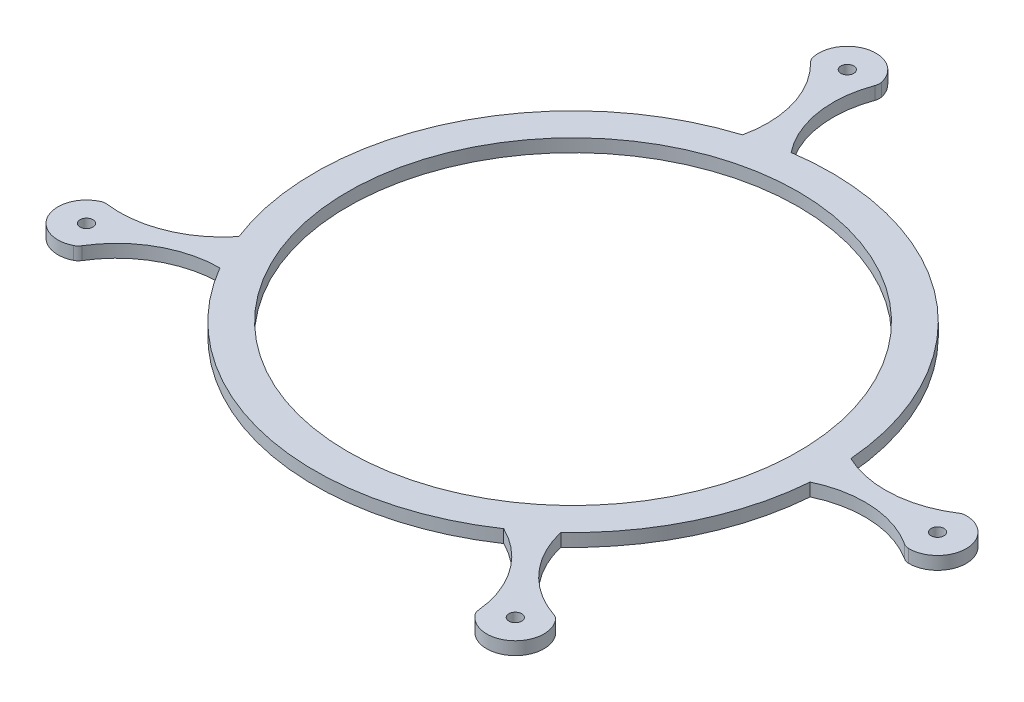
ISO-10303-21;
HEADER;
FILE_DESCRIPTION(('STEP AP214'),'2;1');
FILE_NAME('part.step','',(''),(''),'','','');
FILE_SCHEMA(('AUTOMOTIVE_DESIGN { 1 0 10303 214 1 1 1 1 }'));
ENDSEC;
DATA;
#1=APPLICATION_CONTEXT('core data for automotive mechanical design processes');
#2=APPLICATION_PROTOCOL_DEFINITION('international standard','automotive_design',2000,#1);
#3=PRODUCT_CONTEXT('',#1,'mechanical');
#4=PRODUCT('Part','Part','',(#3));
#5=PRODUCT_RELATED_PRODUCT_CATEGORY('part','',(#4));
#6=PRODUCT_DEFINITION_FORMATION('','',#4);
#7=PRODUCT_DEFINITION_CONTEXT('part definition',#1,'design');
#8=PRODUCT_DEFINITION('design','',#6,#7);
#9=PRODUCT_DEFINITION_SHAPE('','',#8);
#10=(LENGTH_UNIT() NAMED_UNIT(*) SI_UNIT(.MILLI.,.METRE.));
#11=(NAMED_UNIT(*) PLANE_ANGLE_UNIT() SI_UNIT($,.RADIAN.));
#12=(NAMED_UNIT(*) SI_UNIT($,.STERADIAN.) SOLID_ANGLE_UNIT());
#13=UNCERTAINTY_MEASURE_WITH_UNIT(LENGTH_MEASURE(1.E-05),#10,'distance_accuracy_value','');
#14=(GEOMETRIC_REPRESENTATION_CONTEXT(3) GLOBAL_UNCERTAINTY_ASSIGNED_CONTEXT((#13)) GLOBAL_UNIT_ASSIGNED_CONTEXT((#10,
#11,#12)) REPRESENTATION_CONTEXT('',''));
#15=CARTESIAN_POINT('',(0.,0.,0.));
#16=DIRECTION('',(0.,0.,1.));
#17=DIRECTION('',(1.,0.,0.));
#18=AXIS2_PLACEMENT_3D('',#15,#16,#17);
#19=CARTESIAN_POINT('',(20.2378364940883,3.175,203.705607036524));
#20=DIRECTION('',(0.,1.,0.));
#21=DIRECTION('',(0.,0.,1.));
#22=AXIS2_PLACEMENT_3D('',#19,#20,#21);
#23=PLANE('',#22);
#24=CARTESIAN_POINT('',(38.977113713879,3.175,259.76572866438));
#25=DIRECTION('',(0.,1.,0.));
#26=DIRECTION('',(0.,0.,1.));
#27=AXIS2_PLACEMENT_3D('',#24,#25,#26);
#28=CIRCLE('',#27,1.5875);
#29=CARTESIAN_POINT('',(38.977113713879,3.175,261.35322866438));
#30=VERTEX_POINT('',#29);
#31=EDGE_CURVE('E748',#30,#30,#28,.T.);
#32=ORIENTED_EDGE('',*,*,#31,.F.);
#33=EDGE_LOOP('',(#32));
#34=FACE_BOUND('',#33,.T.);
#35=CARTESIAN_POINT('',(-36.8463826333885,3.175,102.316616136352));
#36=DIRECTION('',(0.,1.,0.));
#37=DIRECTION('',(0.,0.,1.));
#38=AXIS2_PLACEMENT_3D('',#35,#36,#37);
#39=CIRCLE('',#38,1.5875);
#40=CARTESIAN_POINT('',(-36.8463826333885,3.175,103.904116136352));
#41=VERTEX_POINT('',#40);
#42=EDGE_CURVE('E760',#41,#41,#39,.T.);
#43=ORIENTED_EDGE('',*,*,#42,.F.);
#44=EDGE_LOOP('',(#43));
#45=FACE_BOUND('',#44,.T.);
#46=CARTESIAN_POINT('',(57.378673689453,3.175,217.716932549327));
#47=DIRECTION('',(0.,-1.,0.));
#48=DIRECTION('',(0.,0.,1.));
#49=AXIS2_PLACEMENT_3D('',#46,#47,#48);
#50=CIRCLE('',#49,25.5117833148735);
#51=CARTESIAN_POINT('',(46.4003306876611,3.175,194.688101210328));
#52=VERTEX_POINT('',#51);
#53=CARTESIAN_POINT('',(71.2743942306114,3.175,196.321605055991));
#54=VERTEX_POINT('',#53);
#55=EDGE_CURVE('E143',#52,#54,#50,.T.);
#56=ORIENTED_EDGE('',*,*,#55,.T.);
#57=CARTESIAN_POINT('',(72.6641172245387,3.175,194.195512395699));
#58=DIRECTION('',(0.,1.,0.));
#59=DIRECTION('',(0.,0.,1.));
#60=AXIS2_PLACEMENT_3D('',#57,#58,#59);
#61=CIRCLE('',#60,2.54000000000001);
#62=CARTESIAN_POINT('',(72.6316015802498,3.175,196.735304263722));
#63=VERTEX_POINT('',#62);
#64=EDGE_CURVE('E411',#54,#63,#61,.T.);
#65=ORIENTED_EDGE('',*,*,#64,.T.);
#66=CARTESIAN_POINT('',(72.7217441599338,3.175,189.694281523722));
#67=DIRECTION('',(0.,1.,0.));
#68=DIRECTION('',(0.,0.,1.));
#69=AXIS2_PLACEMENT_3D('',#66,#67,#68);
#70=CIRCLE('',#69,7.04159974081697);
#71=CARTESIAN_POINT('',(72.6316015802499,3.175,182.653258783721));
#72=VERTEX_POINT('',#71);
#73=EDGE_CURVE('E348',#63,#72,#70,.T.);
#74=ORIENTED_EDGE('',*,*,#73,.T.);
#75=CARTESIAN_POINT('',(72.6641172245386,3.175,185.193050651744));
#76=DIRECTION('',(0.,1.,0.));
#77=DIRECTION('',(0.,0.,1.));
#78=AXIS2_PLACEMENT_3D('',#75,#76,#77);
#79=CIRCLE('',#78,2.53999999999997);
#80=CARTESIAN_POINT('',(71.2743942306112,3.175,183.066957991452));
#81=VERTEX_POINT('',#80);
#82=EDGE_CURVE('E365',#72,#81,#79,.T.);
#83=ORIENTED_EDGE('',*,*,#82,.T.);
#84=CARTESIAN_POINT('',(57.3786736894533,3.175,161.671630498115));
#85=DIRECTION('',(0.,-1.,0.));
#86=DIRECTION('',(0.,0.,-1.));
#87=AXIS2_PLACEMENT_3D('',#84,#85,#86);
#88=CIRCLE('',#87,25.511783314874);
#89=CARTESIAN_POINT('',(46.4003306876612,3.175,184.700461837115));
#90=VERTEX_POINT('',#89);
#91=EDGE_CURVE('E362',#81,#90,#88,.T.);
#92=ORIENTED_EDGE('',*,*,#91,.T.);
#93=CARTESIAN_POINT('',(-16.9030007012765,3.175,189.694281523721));
#94=DIRECTION('',(0.,1.,0.));
#95=DIRECTION('',(0.,0.,1.));
#96=AXIS2_PLACEMENT_3D('',#93,#94,#95);
#97=CIRCLE('',#96,63.5);
#98=CARTESIAN_POINT('',(-26.1207029236127,3.175,126.866867397877));
#99=VERTEX_POINT('',#98);
#100=EDGE_CURVE('E364',#90,#99,#97,.T.);
#101=ORIENTED_EDGE('',*,*,#100,.T.);
#102=CARTESIAN_POINT('',(-6.11216360434647,3.175,111.039377318447));
#103=DIRECTION('',(0.,-1.,0.));
#104=DIRECTION('',(0.,0.,1.));
#105=AXIS2_PLACEMENT_3D('',#102,#103,#104);
#106=CIRCLE('',#105,25.5117833148736);
#107=CARTESIAN_POINT('',(-30.0631542806852,3.175,102.252959759112));
#108=VERTEX_POINT('',#107);
#109=EDGE_CURVE('E367',#99,#108,#106,.T.);
#110=ORIENTED_EDGE('',*,*,#109,.T.);
#111=CARTESIAN_POINT('',(-32.4451838176385,3.175,101.371180146577));
#112=DIRECTION('',(0.,1.,0.));
#113=DIRECTION('',(0.,0.,1.));
#114=AXIS2_PLACEMENT_3D('',#111,#112,#113);
#115=CIRCLE('',#114,2.53999999999999);
#116=CARTESIAN_POINT('',(-29.961834422835,3.175,100.83772369725));
#117=VERTEX_POINT('',#116);
#118=EDGE_CURVE('E373',#108,#117,#115,.T.);
#119=ORIENTED_EDGE('',*,*,#118,.T.);
#120=CARTESIAN_POINT('',(-36.8463826333885,3.175,102.316616136352));
#121=DIRECTION('',(0.,1.,0.));
#122=DIRECTION('',(0.,0.,1.));
#123=AXIS2_PLACEMENT_3D('',#120,#121,#122);
#124=CIRCLE('',#123,7.04159974081698);
#125=CARTESIAN_POINT('',(-43.6908136219012,3.175,103.971273609475));
#126=VERTEX_POINT('',#125);
#127=EDGE_CURVE('E375',#117,#126,#124,.T.);
#128=ORIENTED_EDGE('',*,*,#127,.T.);
#129=CARTESIAN_POINT('',(-41.2219350501687,3.175,103.374416341748));
#130=DIRECTION('',(0.,1.,0.));
#131=DIRECTION('',(0.,0.,1.));
#132=AXIS2_PLACEMENT_3D('',#129,#130,#131);
#133=CIRCLE('',#132,2.54000000000001);
#134=CARTESIAN_POINT('',(-42.9854796700234,3.175,105.202396203175));
#135=VERTEX_POINT('',#134);
#136=EDGE_CURVE('E377',#126,#135,#133,.T.);
#137=ORIENTED_EDGE('',*,*,#136,.T.);
#138=CARTESIAN_POINT('',(-60.7522929207341,3.175,123.510630274746));
#139=DIRECTION('',(0.,-1.,0.));
#140=DIRECTION('',(0.,0.,-1.));
#141=AXIS2_PLACEMENT_3D('',#138,#139,#140);
#142=CIRCLE('',#141,25.511783314874);
#143=CARTESIAN_POINT('',(-35.8579313253644,3.175,129.089326239223));
#144=VERTEX_POINT('',#143);
#145=EDGE_CURVE('E379',#135,#144,#142,.T.);
#146=ORIENTED_EDGE('',*,*,#145,.T.);
#147=CARTESIAN_POINT('',(-16.9030007012765,3.175,189.694281523721));
#148=DIRECTION('',(0.,1.,0.));
#149=DIRECTION('',(0.,0.,1.));
#150=AXIS2_PLACEMENT_3D('',#147,#148,#149);
#151=CIRCLE('',#150,63.5);
#152=CARTESIAN_POINT('',(-76.1040686753232,3.175,212.6612915758));
#153=VERTEX_POINT('',#152);
#154=EDGE_CURVE('E381',#144,#153,#151,.T.);
#155=ORIENTED_EDGE('',*,*,#154,.T.);
#156=CARTESIAN_POINT('',(-95.9870493899646,3.175,196.676355986119));
#157=DIRECTION('',(0.,-1.,0.));
#158=DIRECTION('',(0.,0.,1.));
#159=AXIS2_PLACEMENT_3D('',#156,#157,#158);
#160=CIRCLE('',#159,25.5117833148736);
#161=CARTESIAN_POINT('',(-99.2235763021672,3.175,221.982007162322));
#162=VERTEX_POINT('',#161);
#163=EDGE_CURVE('E383',#153,#162,#160,.T.);
#164=ORIENTED_EDGE('',*,*,#163,.T.);
#165=CARTESIAN_POINT('',(-99.5531964215459,3.175,224.500528668464));
#166=DIRECTION('',(0.,1.,0.));
#167=DIRECTION('',(0.,0.,1.));
#168=AXIS2_PLACEMENT_3D('',#165,#166,#167);
#169=CIRCLE('',#168,2.54);
#170=CARTESIAN_POINT('',(-100.6258752306,3.175,222.198147255099));
#171=VERTEX_POINT('',#170);
#172=EDGE_CURVE('E385',#162,#171,#169,.T.);
#173=ORIENTED_EDGE('',*,*,#172,.T.);
#174=CARTESIAN_POINT('',(-97.6521056149244,3.175,228.581000941559));
#175=DIRECTION('',(0.,1.,0.));
#176=DIRECTION('',(0.,0.,1.));
#177=AXIS2_PLACEMENT_3D('',#174,#175,#176);
#178=CIRCLE('',#177,7.041599740817);
#179=CARTESIAN_POINT('',(-94.5159046833139,3.175,234.885631828966));
#180=VERTEX_POINT('',#179);
#181=EDGE_CURVE('E387',#171,#180,#178,.T.);
#182=ORIENTED_EDGE('',*,*,#181,.T.);
#183=CARTESIAN_POINT('',(-95.6471746588161,3.175,232.611466434249));
#184=DIRECTION('',(0.,1.,0.));
#185=DIRECTION('',(0.,0.,1.));
#186=AXIS2_PLACEMENT_3D('',#183,#184,#185);
#187=CIRCLE('',#186,2.54000000000003);
#188=CARTESIAN_POINT('',(-93.4726004731212,3.175,233.924031522506));
#189=VERTEX_POINT('',#188);
#190=EDGE_CURVE('E389',#180,#189,#187,.T.);
#191=ORIENTED_EDGE('',*,*,#190,.T.);
#192=CARTESIAN_POINT('',(-71.6699041760122,3.175,247.171428326448));
#193=DIRECTION('',(0.,-1.,0.));
#194=DIRECTION('',(0.,0.,-1.));
#195=AXIS2_PLACEMENT_3D('',#192,#193,#194);
#196=CIRCLE('',#195,25.511783314874);
#197=CARTESIAN_POINT('',(-71.7705943591158,3.175,221.659843714902));
#198=VERTEX_POINT('',#197);
#199=EDGE_CURVE('E391',#189,#198,#196,.T.);
#200=ORIENTED_EDGE('',*,*,#199,.T.);
#201=CARTESIAN_POINT('',(-16.9030007012765,3.175,189.694281523721));
#202=DIRECTION('',(0.,1.,0.));
#203=DIRECTION('',(0.,0.,1.));
#204=AXIS2_PLACEMENT_3D('',#201,#202,#203);
#205=CIRCLE('',#204,63.5);
#206=CARTESIAN_POINT('',(18.661655394652,3.175,242.30041459562));
#207=VERTEX_POINT('',#206);
#208=EDGE_CURVE('E393',#198,#207,#205,.T.);
#209=ORIENTED_EDGE('',*,*,#208,.T.);
#210=CARTESIAN_POINT('',(7.50187495230056,3.175,265.241870268344));
#211=DIRECTION('',(0.,-1.,0.));
#212=DIRECTION('',(0.,0.,1.));
#213=AXIS2_PLACEMENT_3D('',#210,#211,#212);
#214=CIRCLE('',#213,25.5117833148735);
#215=CARTESIAN_POINT('',(32.8932556111954,3.175,262.766213559477));
#216=VERTEX_POINT('',#215);
#217=EDGE_CURVE('E395',#207,#216,#214,.T.);
#218=ORIENTED_EDGE('',*,*,#217,.T.);
#219=CARTESIAN_POINT('',(35.4219799017786,3.175,262.52714565654));
#220=DIRECTION('',(0.,1.,0.));
#221=DIRECTION('',(0.,0.,1.));
#222=AXIS2_PLACEMENT_3D('',#219,#220,#221);
#223=CIRCLE('',#222,2.54000000000002);
#224=CARTESIAN_POINT('',(33.4160174878268,3.175,264.085258230718));
#225=VERTEX_POINT('',#224);
#226=EDGE_CURVE('E397',#216,#225,#223,.T.);
#227=ORIENTED_EDGE('',*,*,#226,.T.);
#228=CARTESIAN_POINT('',(38.977113713879,3.175,259.76572866438));
#229=DIRECTION('',(0.,1.,0.));
#230=DIRECTION('',(0.,0.,1.));
#231=AXIS2_PLACEMENT_3D('',#228,#229,#230);
#232=CIRCLE('',#231,7.04159974081696);
#233=CARTESIAN_POINT('',(44.4258039816384,3.175,255.305246484627));
#234=VERTEX_POINT('',#233);
#235=EDGE_CURVE('E211',#225,#234,#232,.T.);
#236=ORIENTED_EDGE('',*,*,#235,.T.);
#237=CARTESIAN_POINT('',(42.4603879129161,3.175,256.914202567561));
#238=DIRECTION('',(0.,1.,0.));
#239=DIRECTION('',(0.,0.,1.));
#240=AXIS2_PLACEMENT_3D('',#237,#238,#239);
#241=CIRCLE('',#240,2.53999999999996);
#242=CARTESIAN_POINT('',(43.2561559752546,3.175,254.5020762875));
#243=VERTEX_POINT('',#242);
#244=EDGE_CURVE('E205',#234,#243,#241,.T.);
#245=ORIENTED_EDGE('',*,*,#244,.T.);
#246=CARTESIAN_POINT('',(51.3198565403681,3.175,230.298195997321));
#247=DIRECTION('',(0.,-1.,0.));
#248=DIRECTION('',(0.,0.,-1.));
#249=AXIS2_PLACEMENT_3D('',#246,#247,#248);
#250=CIRCLE('',#249,25.511783314874);
#251=CARTESIAN_POINT('',(26.4703062921673,3.175,236.073223301779));
#252=VERTEX_POINT('',#251);
#253=EDGE_CURVE('E209',#243,#252,#250,.T.);
#254=ORIENTED_EDGE('',*,*,#253,.T.);
#255=CARTESIAN_POINT('',(-16.9030007012765,3.175,189.694281523721));
#256=DIRECTION('',(0.,1.,0.));
#257=DIRECTION('',(0.,0.,1.));
#258=AXIS2_PLACEMENT_3D('',#255,#256,#257);
#259=CIRCLE('',#258,63.5);
#260=EDGE_CURVE('E54',#252,#52,#259,.T.);
#261=ORIENTED_EDGE('',*,*,#260,.T.);
#262=EDGE_LOOP('',(#56,#65,#74,#83,#92,#101,#110,#119,#128,#137,#146,#155,#164,#173,#182,#191,
#200,#209,#218,#227,#236,#245,#254,#261));
#263=FACE_BOUND('',#262,.T.);
#264=CARTESIAN_POINT('',(-97.6521056149244,3.175,228.581000941559));
#265=DIRECTION('',(0.,1.,0.));
#266=DIRECTION('',(0.,0.,1.));
#267=AXIS2_PLACEMENT_3D('',#264,#265,#266);
#268=CIRCLE('',#267,1.5875);
#269=CARTESIAN_POINT('',(-97.6521056149244,3.175,230.168500941559));
#270=VERTEX_POINT('',#269);
#271=EDGE_CURVE('E232',#270,#270,#268,.T.);
#272=ORIENTED_EDGE('',*,*,#271,.F.);
#273=EDGE_LOOP('',(#272));
#274=FACE_BOUND('',#273,.T.);
#275=CARTESIAN_POINT('',(72.7217441599338,3.175,189.694281523722));
#276=DIRECTION('',(0.,1.,0.));
#277=DIRECTION('',(0.,0.,1.));
#278=AXIS2_PLACEMENT_3D('',#275,#276,#277);
#279=CIRCLE('',#278,1.5875);
#280=CARTESIAN_POINT('',(72.7217441599338,3.175,191.281781523722));
#281=VERTEX_POINT('',#280);
#282=EDGE_CURVE('E754',#281,#281,#279,.T.);
#283=ORIENTED_EDGE('',*,*,#282,.F.);
#284=EDGE_LOOP('',(#283));
#285=FACE_BOUND('',#284,.T.);
#286=CARTESIAN_POINT('',(-16.9030007012765,3.175,189.694281523721));
#287=DIRECTION('',(0.,1.,0.));
#288=DIRECTION('',(0.,0.,1.));
#289=AXIS2_PLACEMENT_3D('',#286,#287,#288);
#290=CIRCLE('',#289,55.372);
#291=CARTESIAN_POINT('',(-16.9030007012765,3.175,245.066281523721));
#292=VERTEX_POINT('',#291);
#293=EDGE_CURVE('E739',#292,#292,#290,.T.);
#294=ORIENTED_EDGE('',*,*,#293,.F.);
#295=EDGE_LOOP('',(#294));
#296=FACE_BOUND('',#295,.T.);
#297=ADVANCED_FACE('F37',(#34,#45,#263,#274,#285,#296),#23,.T.);
#298=CARTESIAN_POINT('',(20.2378364940883,0.,203.705607036524));
#299=DIRECTION('',(0.,1.,0.));
#300=DIRECTION('',(0.,0.,1.));
#301=AXIS2_PLACEMENT_3D('',#298,#299,#300);
#302=PLANE('',#301);
#303=CARTESIAN_POINT('',(38.977113713879,0.,259.76572866438));
#304=DIRECTION('',(0.,1.,0.));
#305=DIRECTION('',(0.,0.,1.));
#306=AXIS2_PLACEMENT_3D('',#303,#304,#305);
#307=CIRCLE('',#306,1.5875);
#308=CARTESIAN_POINT('',(38.977113713879,0.,261.35322866438));
#309=VERTEX_POINT('',#308);
#310=EDGE_CURVE('E745',#309,#309,#307,.T.);
#311=ORIENTED_EDGE('',*,*,#310,.T.);
#312=EDGE_LOOP('',(#311));
#313=FACE_BOUND('',#312,.T.);
#314=CARTESIAN_POINT('',(-36.8463826333885,0.,102.316616136352));
#315=DIRECTION('',(0.,1.,0.));
#316=DIRECTION('',(0.,0.,1.));
#317=AXIS2_PLACEMENT_3D('',#314,#315,#316);
#318=CIRCLE('',#317,1.5875);
#319=CARTESIAN_POINT('',(-36.8463826333885,0.,103.904116136352));
#320=VERTEX_POINT('',#319);
#321=EDGE_CURVE('E757',#320,#320,#318,.T.);
#322=ORIENTED_EDGE('',*,*,#321,.T.);
#323=EDGE_LOOP('',(#322));
#324=FACE_BOUND('',#323,.T.);
#325=CARTESIAN_POINT('',(57.378673689453,0.,217.716932549327));
#326=DIRECTION('',(0.,-1.,0.));
#327=DIRECTION('',(0.,0.,1.));
#328=AXIS2_PLACEMENT_3D('',#325,#326,#327);
#329=CIRCLE('',#328,25.5117833148735);
#330=CARTESIAN_POINT('',(46.4003306876611,0.,194.688101210328));
#331=VERTEX_POINT('',#330);
#332=CARTESIAN_POINT('',(71.2743942306114,0.,196.321605055991));
#333=VERTEX_POINT('',#332);
#334=EDGE_CURVE('E137',#331,#333,#329,.T.);
#335=ORIENTED_EDGE('',*,*,#334,.F.);
#336=CARTESIAN_POINT('',(-16.9030007012765,0.,189.694281523721));
#337=DIRECTION('',(0.,1.,0.));
#338=DIRECTION('',(0.,0.,1.));
#339=AXIS2_PLACEMENT_3D('',#336,#337,#338);
#340=CIRCLE('',#339,63.5);
#341=CARTESIAN_POINT('',(26.4703062921673,0.,236.073223301779));
#342=VERTEX_POINT('',#341);
#343=EDGE_CURVE('E282',#342,#331,#340,.T.);
#344=ORIENTED_EDGE('',*,*,#343,.F.);
#345=CARTESIAN_POINT('',(51.3198565403681,0.,230.298195997321));
#346=DIRECTION('',(0.,-1.,0.));
#347=DIRECTION('',(0.,0.,-1.));
#348=AXIS2_PLACEMENT_3D('',#345,#346,#347);
#349=CIRCLE('',#348,25.511783314874);
#350=CARTESIAN_POINT('',(43.2561559752546,0.,254.5020762875));
#351=VERTEX_POINT('',#350);
#352=EDGE_CURVE('E130',#351,#342,#349,.T.);
#353=ORIENTED_EDGE('',*,*,#352,.F.);
#354=CARTESIAN_POINT('',(42.4603879129161,0.,256.914202567561));
#355=DIRECTION('',(0.,1.,0.));
#356=DIRECTION('',(0.,0.,1.));
#357=AXIS2_PLACEMENT_3D('',#354,#355,#356);
#358=CIRCLE('',#357,2.53999999999996);
#359=CARTESIAN_POINT('',(44.4258039816384,0.,255.305246484627));
#360=VERTEX_POINT('',#359);
#361=EDGE_CURVE('E220',#360,#351,#358,.T.);
#362=ORIENTED_EDGE('',*,*,#361,.F.);
#363=CARTESIAN_POINT('',(38.977113713879,0.,259.76572866438));
#364=DIRECTION('',(0.,1.,0.));
#365=DIRECTION('',(0.,0.,1.));
#366=AXIS2_PLACEMENT_3D('',#363,#364,#365);
#367=CIRCLE('',#366,7.04159974081696);
#368=CARTESIAN_POINT('',(33.4160174878268,0.,264.085258230718));
#369=VERTEX_POINT('',#368);
#370=EDGE_CURVE('E278',#369,#360,#367,.T.);
#371=ORIENTED_EDGE('',*,*,#370,.F.);
#372=CARTESIAN_POINT('',(35.4219799017786,0.,262.52714565654));
#373=DIRECTION('',(0.,1.,0.));
#374=DIRECTION('',(0.,0.,1.));
#375=AXIS2_PLACEMENT_3D('',#372,#373,#374);
#376=CIRCLE('',#375,2.54000000000002);
#377=CARTESIAN_POINT('',(32.8932556111954,0.,262.766213559477));
#378=VERTEX_POINT('',#377);
#379=EDGE_CURVE('E276',#378,#369,#376,.T.);
#380=ORIENTED_EDGE('',*,*,#379,.F.);
#381=CARTESIAN_POINT('',(7.50187495230056,0.,265.241870268344));
#382=DIRECTION('',(0.,-1.,0.));
#383=DIRECTION('',(0.,0.,1.));
#384=AXIS2_PLACEMENT_3D('',#381,#382,#383);
#385=CIRCLE('',#384,25.5117833148735);
#386=CARTESIAN_POINT('',(18.661655394652,0.,242.30041459562));
#387=VERTEX_POINT('',#386);
#388=EDGE_CURVE('E274',#387,#378,#385,.T.);
#389=ORIENTED_EDGE('',*,*,#388,.F.);
#390=CARTESIAN_POINT('',(-16.9030007012765,0.,189.694281523721));
#391=DIRECTION('',(0.,1.,0.));
#392=DIRECTION('',(0.,0.,1.));
#393=AXIS2_PLACEMENT_3D('',#390,#391,#392);
#394=CIRCLE('',#393,63.5);
#395=CARTESIAN_POINT('',(-71.7705943591158,0.,221.659843714902));
#396=VERTEX_POINT('',#395);
#397=EDGE_CURVE('E271',#396,#387,#394,.T.);
#398=ORIENTED_EDGE('',*,*,#397,.F.);
#399=CARTESIAN_POINT('',(-71.6699041760122,0.,247.171428326448));
#400=DIRECTION('',(0.,-1.,0.));
#401=DIRECTION('',(0.,0.,-1.));
#402=AXIS2_PLACEMENT_3D('',#399,#400,#401);
#403=CIRCLE('',#402,25.511783314874);
#404=CARTESIAN_POINT('',(-93.4726004731212,0.,233.924031522506));
#405=VERTEX_POINT('',#404);
#406=EDGE_CURVE('E268',#405,#396,#403,.T.);
#407=ORIENTED_EDGE('',*,*,#406,.F.);
#408=CARTESIAN_POINT('',(-95.6471746588161,0.,232.611466434249));
#409=DIRECTION('',(0.,1.,0.));
#410=DIRECTION('',(0.,0.,1.));
#411=AXIS2_PLACEMENT_3D('',#408,#409,#410);
#412=CIRCLE('',#411,2.54000000000003);
#413=CARTESIAN_POINT('',(-94.5159046833139,0.,234.885631828966));
#414=VERTEX_POINT('',#413);
#415=EDGE_CURVE('E265',#414,#405,#412,.T.);
#416=ORIENTED_EDGE('',*,*,#415,.F.);
#417=CARTESIAN_POINT('',(-97.6521056149244,0.,228.581000941559));
#418=DIRECTION('',(0.,1.,0.));
#419=DIRECTION('',(0.,0.,1.));
#420=AXIS2_PLACEMENT_3D('',#417,#418,#419);
#421=CIRCLE('',#420,7.041599740817);
#422=CARTESIAN_POINT('',(-100.6258752306,0.,222.198147255099));
#423=VERTEX_POINT('',#422);
#424=EDGE_CURVE('E263',#423,#414,#421,.T.);
#425=ORIENTED_EDGE('',*,*,#424,.F.);
#426=CARTESIAN_POINT('',(-99.5531964215459,0.,224.500528668464));
#427=DIRECTION('',(0.,1.,0.));
#428=DIRECTION('',(0.,0.,1.));
#429=AXIS2_PLACEMENT_3D('',#426,#427,#428);
#430=CIRCLE('',#429,2.54);
#431=CARTESIAN_POINT('',(-99.2235763021672,0.,221.982007162322));
#432=VERTEX_POINT('',#431);
#433=EDGE_CURVE('E261',#432,#423,#430,.T.);
#434=ORIENTED_EDGE('',*,*,#433,.F.);
#435=CARTESIAN_POINT('',(-95.9870493899646,0.,196.676355986119));
#436=DIRECTION('',(0.,-1.,0.));
#437=DIRECTION('',(0.,0.,1.));
#438=AXIS2_PLACEMENT_3D('',#435,#436,#437);
#439=CIRCLE('',#438,25.5117833148736);
#440=CARTESIAN_POINT('',(-76.1040686753232,0.,212.6612915758));
#441=VERTEX_POINT('',#440);
#442=EDGE_CURVE('E259',#441,#432,#439,.T.);
#443=ORIENTED_EDGE('',*,*,#442,.F.);
#444=CARTESIAN_POINT('',(-16.9030007012765,0.,189.694281523721));
#445=DIRECTION('',(0.,1.,0.));
#446=DIRECTION('',(0.,0.,1.));
#447=AXIS2_PLACEMENT_3D('',#444,#445,#446);
#448=CIRCLE('',#447,63.5);
#449=CARTESIAN_POINT('',(-35.8579313253644,0.,129.089326239223));
#450=VERTEX_POINT('',#449);
#451=EDGE_CURVE('E256',#450,#441,#448,.T.);
#452=ORIENTED_EDGE('',*,*,#451,.F.);
#453=CARTESIAN_POINT('',(-60.7522929207341,0.,123.510630274746));
#454=DIRECTION('',(0.,-1.,0.));
#455=DIRECTION('',(0.,0.,-1.));
#456=AXIS2_PLACEMENT_3D('',#453,#454,#455);
#457=CIRCLE('',#456,25.511783314874);
#458=CARTESIAN_POINT('',(-42.9854796700234,0.,105.202396203175));
#459=VERTEX_POINT('',#458);
#460=EDGE_CURVE('E254',#459,#450,#457,.T.);
#461=ORIENTED_EDGE('',*,*,#460,.F.);
#462=CARTESIAN_POINT('',(-41.2219350501687,0.,103.374416341748));
#463=DIRECTION('',(0.,1.,0.));
#464=DIRECTION('',(0.,0.,1.));
#465=AXIS2_PLACEMENT_3D('',#462,#463,#464);
#466=CIRCLE('',#465,2.54000000000001);
#467=CARTESIAN_POINT('',(-43.6908136219012,0.,103.971273609475));
#468=VERTEX_POINT('',#467);
#469=EDGE_CURVE('E251',#468,#459,#466,.T.);
#470=ORIENTED_EDGE('',*,*,#469,.F.);
#471=CARTESIAN_POINT('',(-36.8463826333885,0.,102.316616136352));
#472=DIRECTION('',(0.,1.,0.));
#473=DIRECTION('',(0.,0.,1.));
#474=AXIS2_PLACEMENT_3D('',#471,#472,#473);
#475=CIRCLE('',#474,7.04159974081698);
#476=CARTESIAN_POINT('',(-29.961834422835,0.,100.83772369725));
#477=VERTEX_POINT('',#476);
#478=EDGE_CURVE('E249',#477,#468,#475,.T.);
#479=ORIENTED_EDGE('',*,*,#478,.F.);
#480=CARTESIAN_POINT('',(-32.4451838176385,0.,101.371180146577));
#481=DIRECTION('',(0.,1.,0.));
#482=DIRECTION('',(0.,0.,1.));
#483=AXIS2_PLACEMENT_3D('',#480,#481,#482);
#484=CIRCLE('',#483,2.53999999999999);
#485=CARTESIAN_POINT('',(-30.0631542806852,0.,102.252959759112));
#486=VERTEX_POINT('',#485);
#487=EDGE_CURVE('E247',#486,#477,#484,.T.);
#488=ORIENTED_EDGE('',*,*,#487,.F.);
#489=CARTESIAN_POINT('',(-6.11216360434647,0.,111.039377318447));
#490=DIRECTION('',(0.,-1.,0.));
#491=DIRECTION('',(0.,0.,1.));
#492=AXIS2_PLACEMENT_3D('',#489,#490,#491);
#493=CIRCLE('',#492,25.5117833148736);
#494=CARTESIAN_POINT('',(-26.1207029236127,0.,126.866867397877));
#495=VERTEX_POINT('',#494);
#496=EDGE_CURVE('E245',#495,#486,#493,.T.);
#497=ORIENTED_EDGE('',*,*,#496,.F.);
#498=CARTESIAN_POINT('',(-16.9030007012765,0.,189.694281523721));
#499=DIRECTION('',(0.,1.,0.));
#500=DIRECTION('',(0.,0.,1.));
#501=AXIS2_PLACEMENT_3D('',#498,#499,#500);
#502=CIRCLE('',#501,63.5);
#503=CARTESIAN_POINT('',(46.4003306876612,0.,184.700461837115));
#504=VERTEX_POINT('',#503);
#505=EDGE_CURVE('E242',#504,#495,#502,.T.);
#506=ORIENTED_EDGE('',*,*,#505,.F.);
#507=CARTESIAN_POINT('',(57.3786736894533,0.,161.671630498115));
#508=DIRECTION('',(0.,-1.,0.));
#509=DIRECTION('',(0.,0.,-1.));
#510=AXIS2_PLACEMENT_3D('',#507,#508,#509);
#511=CIRCLE('',#510,25.511783314874);
#512=CARTESIAN_POINT('',(71.2743942306112,0.,183.066957991452));
#513=VERTEX_POINT('',#512);
#514=EDGE_CURVE('E239',#513,#504,#511,.T.);
#515=ORIENTED_EDGE('',*,*,#514,.F.);
#516=CARTESIAN_POINT('',(72.6641172245386,0.,185.193050651744));
#517=DIRECTION('',(0.,1.,0.));
#518=DIRECTION('',(0.,0.,1.));
#519=AXIS2_PLACEMENT_3D('',#516,#517,#518);
#520=CIRCLE('',#519,2.53999999999997);
#521=CARTESIAN_POINT('',(72.6316015802499,0.,182.653258783721));
#522=VERTEX_POINT('',#521);
#523=EDGE_CURVE('E236',#522,#513,#520,.T.);
#524=ORIENTED_EDGE('',*,*,#523,.F.);
#525=CARTESIAN_POINT('',(72.7217441599338,0.,189.694281523722));
#526=DIRECTION('',(0.,1.,0.));
#527=DIRECTION('',(0.,0.,1.));
#528=AXIS2_PLACEMENT_3D('',#525,#526,#527);
#529=CIRCLE('',#528,7.04159974081697);
#530=CARTESIAN_POINT('',(72.6316015802498,0.,196.735304263722));
#531=VERTEX_POINT('',#530);
#532=EDGE_CURVE('E234',#531,#522,#529,.T.);
#533=ORIENTED_EDGE('',*,*,#532,.F.);
#534=CARTESIAN_POINT('',(72.6641172245387,0.,194.195512395699));
#535=DIRECTION('',(0.,1.,0.));
#536=DIRECTION('',(0.,0.,1.));
#537=AXIS2_PLACEMENT_3D('',#534,#535,#536);
#538=CIRCLE('',#537,2.54000000000001);
#539=EDGE_CURVE('E231',#333,#531,#538,.T.);
#540=ORIENTED_EDGE('',*,*,#539,.F.);
#541=EDGE_LOOP('',(#335,#344,#353,#362,#371,#380,#389,#398,#407,#416,#425,#434,#443,#452,#461,
#470,#479,#488,#497,#506,#515,#524,#533,#540));
#542=FACE_BOUND('',#541,.T.);
#543=CARTESIAN_POINT('',(-97.6521056149244,0.,228.581000941559));
#544=DIRECTION('',(0.,1.,0.));
#545=DIRECTION('',(0.,0.,1.));
#546=AXIS2_PLACEMENT_3D('',#543,#544,#545);
#547=CIRCLE('',#546,1.5875);
#548=CARTESIAN_POINT('',(-97.6521056149244,0.,230.168500941559));
#549=VERTEX_POINT('',#548);
#550=EDGE_CURVE('E415',#549,#549,#547,.T.);
#551=ORIENTED_EDGE('',*,*,#550,.T.);
#552=EDGE_LOOP('',(#551));
#553=FACE_BOUND('',#552,.T.);
#554=CARTESIAN_POINT('',(72.7217441599338,0.,189.694281523722));
#555=DIRECTION('',(0.,1.,0.));
#556=DIRECTION('',(0.,0.,1.));
#557=AXIS2_PLACEMENT_3D('',#554,#555,#556);
#558=CIRCLE('',#557,1.5875);
#559=CARTESIAN_POINT('',(72.7217441599338,0.,191.281781523722));
#560=VERTEX_POINT('',#559);
#561=EDGE_CURVE('E751',#560,#560,#558,.T.);
#562=ORIENTED_EDGE('',*,*,#561,.T.);
#563=EDGE_LOOP('',(#562));
#564=FACE_BOUND('',#563,.T.);
#565=CARTESIAN_POINT('',(-16.9030007012765,0.,189.694281523721));
#566=DIRECTION('',(0.,1.,0.));
#567=DIRECTION('',(0.,0.,1.));
#568=AXIS2_PLACEMENT_3D('',#565,#566,#567);
#569=CIRCLE('',#568,55.372);
#570=CARTESIAN_POINT('',(-16.9030007012765,0.,245.066281523721));
#571=VERTEX_POINT('',#570);
#572=EDGE_CURVE('E742',#571,#571,#569,.T.);
#573=ORIENTED_EDGE('',*,*,#572,.T.);
#574=EDGE_LOOP('',(#573));
#575=FACE_BOUND('',#574,.T.);
#576=ADVANCED_FACE('F352',(#313,#324,#542,#553,#564,#575),#302,.F.);
#577=CARTESIAN_POINT('',(57.378673689453,3.175,217.716932549327));
#578=DIRECTION('',(0.,-1.,0.));
#579=DIRECTION('',(0.,0.,-1.));
#580=AXIS2_PLACEMENT_3D('',#577,#578,#579);
#581=CYLINDRICAL_SURFACE('',#580,25.5117833148735);
#582=ORIENTED_EDGE('',*,*,#334,.T.);
#583=DIRECTION('',(0.,-1.,0.));
#584=VECTOR('',#583,1.);
#585=CARTESIAN_POINT('',(71.2743942306114,3.175,196.321605055991));
#586=LINE('',#585,#584);
#587=EDGE_CURVE('E11',#54,#333,#586,.T.);
#588=ORIENTED_EDGE('',*,*,#587,.F.);
#589=ORIENTED_EDGE('',*,*,#55,.F.);
#590=DIRECTION('',(0.,-1.,0.));
#591=VECTOR('',#590,1.);
#592=CARTESIAN_POINT('',(46.4003306876611,3.175,194.688101210328));
#593=LINE('',#592,#591);
#594=EDGE_CURVE('E226',#52,#331,#593,.T.);
#595=ORIENTED_EDGE('',*,*,#594,.T.);
#596=EDGE_LOOP('',(#582,#588,#589,#595));
#597=FACE_BOUND('',#596,.T.);
#598=ADVANCED_FACE('F39',(#597),#581,.F.);
#599=CARTESIAN_POINT('',(72.6641172245387,3.175,194.195512395699));
#600=DIRECTION('',(0.,-1.,0.));
#601=DIRECTION('',(0.,0.,-1.));
#602=AXIS2_PLACEMENT_3D('',#599,#600,#601);
#603=CYLINDRICAL_SURFACE('',#602,2.54000000000001);
#604=ORIENTED_EDGE('',*,*,#539,.T.);
#605=DIRECTION('',(0.,-1.,0.));
#606=VECTOR('',#605,1.);
#607=CARTESIAN_POINT('',(72.6316015802498,3.175,196.735304263722));
#608=LINE('',#607,#606);
#609=EDGE_CURVE('E46',#63,#531,#608,.T.);
#610=ORIENTED_EDGE('',*,*,#609,.F.);
#611=ORIENTED_EDGE('',*,*,#64,.F.);
#612=ORIENTED_EDGE('',*,*,#587,.T.);
#613=EDGE_LOOP('',(#604,#610,#611,#612));
#614=FACE_BOUND('',#613,.T.);
#615=ADVANCED_FACE('F417',(#614),#603,.T.);
#616=CARTESIAN_POINT('',(72.7217441599338,3.175,189.694281523722));
#617=DIRECTION('',(0.,-1.,0.));
#618=DIRECTION('',(0.,0.,-1.));
#619=AXIS2_PLACEMENT_3D('',#616,#617,#618);
#620=CYLINDRICAL_SURFACE('',#619,7.04159974081697);
#621=ORIENTED_EDGE('',*,*,#532,.T.);
#622=DIRECTION('',(0.,-1.,0.));
#623=VECTOR('',#622,1.);
#624=CARTESIAN_POINT('',(72.6316015802499,3.175,182.653258783721));
#625=LINE('',#624,#623);
#626=EDGE_CURVE('E339',#72,#522,#625,.T.);
#627=ORIENTED_EDGE('',*,*,#626,.F.);
#628=ORIENTED_EDGE('',*,*,#73,.F.);
#629=ORIENTED_EDGE('',*,*,#609,.T.);
#630=EDGE_LOOP('',(#621,#627,#628,#629));
#631=FACE_BOUND('',#630,.T.);
#632=ADVANCED_FACE('F346',(#631),#620,.T.);
#633=CARTESIAN_POINT('',(72.6641172245386,3.175,185.193050651744));
#634=DIRECTION('',(0.,-1.,0.));
#635=DIRECTION('',(0.,0.,-1.));
#636=AXIS2_PLACEMENT_3D('',#633,#634,#635);
#637=CYLINDRICAL_SURFACE('',#636,2.53999999999997);
#638=ORIENTED_EDGE('',*,*,#523,.T.);
#639=DIRECTION('',(0.,-1.,0.));
#640=VECTOR('',#639,1.);
#641=CARTESIAN_POINT('',(71.2743942306112,3.175,183.066957991452));
#642=LINE('',#641,#640);
#643=EDGE_CURVE('E336',#81,#513,#642,.T.);
#644=ORIENTED_EDGE('',*,*,#643,.F.);
#645=ORIENTED_EDGE('',*,*,#82,.F.);
#646=ORIENTED_EDGE('',*,*,#626,.T.);
#647=EDGE_LOOP('',(#638,#644,#645,#646));
#648=FACE_BOUND('',#647,.T.);
#649=ADVANCED_FACE('F356',(#648),#637,.T.);
#650=CARTESIAN_POINT('',(57.3786736894533,3.175,161.671630498115));
#651=DIRECTION('',(0.,-1.,0.));
#652=DIRECTION('',(0.,0.,-1.));
#653=AXIS2_PLACEMENT_3D('',#650,#651,#652);
#654=CYLINDRICAL_SURFACE('',#653,25.511783314874);
#655=ORIENTED_EDGE('',*,*,#514,.T.);
#656=DIRECTION('',(0.,-1.,0.));
#657=VECTOR('',#656,1.);
#658=CARTESIAN_POINT('',(46.4003306876612,3.175,184.700461837115));
#659=LINE('',#658,#657);
#660=EDGE_CURVE('E333',#90,#504,#659,.T.);
#661=ORIENTED_EDGE('',*,*,#660,.F.);
#662=ORIENTED_EDGE('',*,*,#91,.F.);
#663=ORIENTED_EDGE('',*,*,#643,.T.);
#664=EDGE_LOOP('',(#655,#661,#662,#663));
#665=FACE_BOUND('',#664,.T.);
#666=ADVANCED_FACE('F360',(#665),#654,.F.);
#667=CARTESIAN_POINT('',(-16.9030007012765,3.175,189.694281523721));
#668=DIRECTION('',(0.,-1.,0.));
#669=DIRECTION('',(0.,0.,-1.));
#670=AXIS2_PLACEMENT_3D('',#667,#668,#669);
#671=CYLINDRICAL_SURFACE('',#670,63.5);
#672=ORIENTED_EDGE('',*,*,#505,.T.);
#673=DIRECTION('',(0.,-1.,0.));
#674=VECTOR('',#673,1.);
#675=CARTESIAN_POINT('',(-26.1207029236127,3.175,126.866867397877));
#676=LINE('',#675,#674);
#677=EDGE_CURVE('E330',#99,#495,#676,.T.);
#678=ORIENTED_EDGE('',*,*,#677,.F.);
#679=ORIENTED_EDGE('',*,*,#100,.F.);
#680=ORIENTED_EDGE('',*,*,#660,.T.);
#681=EDGE_LOOP('',(#672,#678,#679,#680));
#682=FACE_BOUND('',#681,.T.);
#683=ADVANCED_FACE('F499',(#682),#671,.T.);
#684=CARTESIAN_POINT('',(-6.11216360434647,3.175,111.039377318447));
#685=DIRECTION('',(0.,-1.,0.));
#686=DIRECTION('',(0.,0.,-1.));
#687=AXIS2_PLACEMENT_3D('',#684,#685,#686);
#688=CYLINDRICAL_SURFACE('',#687,25.5117833148736);
#689=ORIENTED_EDGE('',*,*,#496,.T.);
#690=DIRECTION('',(0.,-1.,0.));
#691=VECTOR('',#690,1.);
#692=CARTESIAN_POINT('',(-30.0631542806852,3.175,102.252959759112));
#693=LINE('',#692,#691);
#694=EDGE_CURVE('E327',#108,#486,#693,.T.);
#695=ORIENTED_EDGE('',*,*,#694,.F.);
#696=ORIENTED_EDGE('',*,*,#109,.F.);
#697=ORIENTED_EDGE('',*,*,#677,.T.);
#698=EDGE_LOOP('',(#689,#695,#696,#697));
#699=FACE_BOUND('',#698,.T.);
#700=ADVANCED_FACE('F495',(#699),#688,.F.);
#701=CARTESIAN_POINT('',(-32.4451838176385,3.175,101.371180146577));
#702=DIRECTION('',(0.,-1.,0.));
#703=DIRECTION('',(0.,0.,-1.));
#704=AXIS2_PLACEMENT_3D('',#701,#702,#703);
#705=CYLINDRICAL_SURFACE('',#704,2.53999999999999);
#706=ORIENTED_EDGE('',*,*,#487,.T.);
#707=DIRECTION('',(0.,-1.,0.));
#708=VECTOR('',#707,1.);
#709=CARTESIAN_POINT('',(-29.961834422835,3.175,100.83772369725));
#710=LINE('',#709,#708);
#711=EDGE_CURVE('E324',#117,#477,#710,.T.);
#712=ORIENTED_EDGE('',*,*,#711,.F.);
#713=ORIENTED_EDGE('',*,*,#118,.F.);
#714=ORIENTED_EDGE('',*,*,#694,.T.);
#715=EDGE_LOOP('',(#706,#712,#713,#714));
#716=FACE_BOUND('',#715,.T.);
#717=ADVANCED_FACE('F491',(#716),#705,.T.);
#718=CARTESIAN_POINT('',(-36.8463826333885,3.175,102.316616136352));
#719=DIRECTION('',(0.,-1.,0.));
#720=DIRECTION('',(0.,0.,-1.));
#721=AXIS2_PLACEMENT_3D('',#718,#719,#720);
#722=CYLINDRICAL_SURFACE('',#721,7.04159974081698);
#723=ORIENTED_EDGE('',*,*,#478,.T.);
#724=DIRECTION('',(0.,-1.,0.));
#725=VECTOR('',#724,1.);
#726=CARTESIAN_POINT('',(-43.6908136219012,3.175,103.971273609475));
#727=LINE('',#726,#725);
#728=EDGE_CURVE('E321',#126,#468,#727,.T.);
#729=ORIENTED_EDGE('',*,*,#728,.F.);
#730=ORIENTED_EDGE('',*,*,#127,.F.);
#731=ORIENTED_EDGE('',*,*,#711,.T.);
#732=EDGE_LOOP('',(#723,#729,#730,#731));
#733=FACE_BOUND('',#732,.T.);
#734=ADVANCED_FACE('F487',(#733),#722,.T.);
#735=CARTESIAN_POINT('',(-41.2219350501687,3.175,103.374416341748));
#736=DIRECTION('',(0.,-1.,0.));
#737=DIRECTION('',(0.,0.,-1.));
#738=AXIS2_PLACEMENT_3D('',#735,#736,#737);
#739=CYLINDRICAL_SURFACE('',#738,2.54000000000001);
#740=ORIENTED_EDGE('',*,*,#469,.T.);
#741=DIRECTION('',(0.,-1.,0.));
#742=VECTOR('',#741,1.);
#743=CARTESIAN_POINT('',(-42.9854796700234,3.175,105.202396203175));
#744=LINE('',#743,#742);
#745=EDGE_CURVE('E318',#135,#459,#744,.T.);
#746=ORIENTED_EDGE('',*,*,#745,.F.);
#747=ORIENTED_EDGE('',*,*,#136,.F.);
#748=ORIENTED_EDGE('',*,*,#728,.T.);
#749=EDGE_LOOP('',(#740,#746,#747,#748));
#750=FACE_BOUND('',#749,.T.);
#751=ADVANCED_FACE('F483',(#750),#739,.T.);
#752=CARTESIAN_POINT('',(-60.7522929207341,3.175,123.510630274746));
#753=DIRECTION('',(0.,-1.,0.));
#754=DIRECTION('',(0.,0.,-1.));
#755=AXIS2_PLACEMENT_3D('',#752,#753,#754);
#756=CYLINDRICAL_SURFACE('',#755,25.511783314874);
#757=ORIENTED_EDGE('',*,*,#460,.T.);
#758=DIRECTION('',(0.,-1.,0.));
#759=VECTOR('',#758,1.);
#760=CARTESIAN_POINT('',(-35.8579313253644,3.175,129.089326239223));
#761=LINE('',#760,#759);
#762=EDGE_CURVE('E315',#144,#450,#761,.T.);
#763=ORIENTED_EDGE('',*,*,#762,.F.);
#764=ORIENTED_EDGE('',*,*,#145,.F.);
#765=ORIENTED_EDGE('',*,*,#745,.T.);
#766=EDGE_LOOP('',(#757,#763,#764,#765));
#767=FACE_BOUND('',#766,.T.);
#768=ADVANCED_FACE('F479',(#767),#756,.F.);
#769=CARTESIAN_POINT('',(-16.9030007012765,3.175,189.694281523721));
#770=DIRECTION('',(0.,-1.,0.));
#771=DIRECTION('',(0.,0.,-1.));
#772=AXIS2_PLACEMENT_3D('',#769,#770,#771);
#773=CYLINDRICAL_SURFACE('',#772,63.5);
#774=ORIENTED_EDGE('',*,*,#451,.T.);
#775=DIRECTION('',(0.,-1.,0.));
#776=VECTOR('',#775,1.);
#777=CARTESIAN_POINT('',(-76.1040686753232,3.175,212.6612915758));
#778=LINE('',#777,#776);
#779=EDGE_CURVE('E312',#153,#441,#778,.T.);
#780=ORIENTED_EDGE('',*,*,#779,.F.);
#781=ORIENTED_EDGE('',*,*,#154,.F.);
#782=ORIENTED_EDGE('',*,*,#762,.T.);
#783=EDGE_LOOP('',(#774,#780,#781,#782));
#784=FACE_BOUND('',#783,.T.);
#785=ADVANCED_FACE('F475',(#784),#773,.T.);
#786=CARTESIAN_POINT('',(-95.9870493899646,3.175,196.676355986119));
#787=DIRECTION('',(0.,-1.,0.));
#788=DIRECTION('',(0.,0.,-1.));
#789=AXIS2_PLACEMENT_3D('',#786,#787,#788);
#790=CYLINDRICAL_SURFACE('',#789,25.5117833148736);
#791=ORIENTED_EDGE('',*,*,#442,.T.);
#792=DIRECTION('',(0.,-1.,0.));
#793=VECTOR('',#792,1.);
#794=CARTESIAN_POINT('',(-99.2235763021672,3.175,221.982007162322));
#795=LINE('',#794,#793);
#796=EDGE_CURVE('E309',#162,#432,#795,.T.);
#797=ORIENTED_EDGE('',*,*,#796,.F.);
#798=ORIENTED_EDGE('',*,*,#163,.F.);
#799=ORIENTED_EDGE('',*,*,#779,.T.);
#800=EDGE_LOOP('',(#791,#797,#798,#799));
#801=FACE_BOUND('',#800,.T.);
#802=ADVANCED_FACE('F471',(#801),#790,.F.);
#803=CARTESIAN_POINT('',(-99.5531964215459,3.175,224.500528668464));
#804=DIRECTION('',(0.,-1.,0.));
#805=DIRECTION('',(0.,0.,-1.));
#806=AXIS2_PLACEMENT_3D('',#803,#804,#805);
#807=CYLINDRICAL_SURFACE('',#806,2.54);
#808=ORIENTED_EDGE('',*,*,#433,.T.);
#809=DIRECTION('',(0.,-1.,0.));
#810=VECTOR('',#809,1.);
#811=CARTESIAN_POINT('',(-100.6258752306,3.175,222.198147255099));
#812=LINE('',#811,#810);
#813=EDGE_CURVE('E306',#171,#423,#812,.T.);
#814=ORIENTED_EDGE('',*,*,#813,.F.);
#815=ORIENTED_EDGE('',*,*,#172,.F.);
#816=ORIENTED_EDGE('',*,*,#796,.T.);
#817=EDGE_LOOP('',(#808,#814,#815,#816));
#818=FACE_BOUND('',#817,.T.);
#819=ADVANCED_FACE('F467',(#818),#807,.T.);
#820=CARTESIAN_POINT('',(-97.6521056149244,3.175,228.581000941559));
#821=DIRECTION('',(0.,-1.,0.));
#822=DIRECTION('',(0.,0.,-1.));
#823=AXIS2_PLACEMENT_3D('',#820,#821,#822);
#824=CYLINDRICAL_SURFACE('',#823,7.041599740817);
#825=ORIENTED_EDGE('',*,*,#424,.T.);
#826=DIRECTION('',(0.,-1.,0.));
#827=VECTOR('',#826,1.);
#828=CARTESIAN_POINT('',(-94.5159046833139,3.175,234.885631828966));
#829=LINE('',#828,#827);
#830=EDGE_CURVE('E303',#180,#414,#829,.T.);
#831=ORIENTED_EDGE('',*,*,#830,.F.);
#832=ORIENTED_EDGE('',*,*,#181,.F.);
#833=ORIENTED_EDGE('',*,*,#813,.T.);
#834=EDGE_LOOP('',(#825,#831,#832,#833));
#835=FACE_BOUND('',#834,.T.);
#836=ADVANCED_FACE('F463',(#835),#824,.T.);
#837=CARTESIAN_POINT('',(-95.6471746588161,3.175,232.611466434249));
#838=DIRECTION('',(0.,-1.,0.));
#839=DIRECTION('',(0.,0.,-1.));
#840=AXIS2_PLACEMENT_3D('',#837,#838,#839);
#841=CYLINDRICAL_SURFACE('',#840,2.54000000000003);
#842=ORIENTED_EDGE('',*,*,#415,.T.);
#843=DIRECTION('',(0.,-1.,0.));
#844=VECTOR('',#843,1.);
#845=CARTESIAN_POINT('',(-93.4726004731212,3.175,233.924031522506));
#846=LINE('',#845,#844);
#847=EDGE_CURVE('E300',#189,#405,#846,.T.);
#848=ORIENTED_EDGE('',*,*,#847,.F.);
#849=ORIENTED_EDGE('',*,*,#190,.F.);
#850=ORIENTED_EDGE('',*,*,#830,.T.);
#851=EDGE_LOOP('',(#842,#848,#849,#850));
#852=FACE_BOUND('',#851,.T.);
#853=ADVANCED_FACE('F459',(#852),#841,.T.);
#854=CARTESIAN_POINT('',(-71.6699041760122,3.175,247.171428326448));
#855=DIRECTION('',(0.,-1.,0.));
#856=DIRECTION('',(0.,0.,-1.));
#857=AXIS2_PLACEMENT_3D('',#854,#855,#856);
#858=CYLINDRICAL_SURFACE('',#857,25.511783314874);
#859=ORIENTED_EDGE('',*,*,#406,.T.);
#860=DIRECTION('',(0.,-1.,0.));
#861=VECTOR('',#860,1.);
#862=CARTESIAN_POINT('',(-71.7705943591158,3.175,221.659843714902));
#863=LINE('',#862,#861);
#864=EDGE_CURVE('E297',#198,#396,#863,.T.);
#865=ORIENTED_EDGE('',*,*,#864,.F.);
#866=ORIENTED_EDGE('',*,*,#199,.F.);
#867=ORIENTED_EDGE('',*,*,#847,.T.);
#868=EDGE_LOOP('',(#859,#865,#866,#867));
#869=FACE_BOUND('',#868,.T.);
#870=ADVANCED_FACE('F455',(#869),#858,.F.);
#871=CARTESIAN_POINT('',(-16.9030007012765,3.175,189.694281523721));
#872=DIRECTION('',(0.,-1.,0.));
#873=DIRECTION('',(0.,0.,-1.));
#874=AXIS2_PLACEMENT_3D('',#871,#872,#873);
#875=CYLINDRICAL_SURFACE('',#874,63.5);
#876=ORIENTED_EDGE('',*,*,#397,.T.);
#877=DIRECTION('',(0.,-1.,0.));
#878=VECTOR('',#877,1.);
#879=CARTESIAN_POINT('',(18.661655394652,3.175,242.30041459562));
#880=LINE('',#879,#878);
#881=EDGE_CURVE('E294',#207,#387,#880,.T.);
#882=ORIENTED_EDGE('',*,*,#881,.F.);
#883=ORIENTED_EDGE('',*,*,#208,.F.);
#884=ORIENTED_EDGE('',*,*,#864,.T.);
#885=EDGE_LOOP('',(#876,#882,#883,#884));
#886=FACE_BOUND('',#885,.T.);
#887=ADVANCED_FACE('F451',(#886),#875,.T.);
#888=CARTESIAN_POINT('',(7.50187495230056,3.175,265.241870268344));
#889=DIRECTION('',(0.,-1.,0.));
#890=DIRECTION('',(0.,0.,-1.));
#891=AXIS2_PLACEMENT_3D('',#888,#889,#890);
#892=CYLINDRICAL_SURFACE('',#891,25.5117833148735);
#893=ORIENTED_EDGE('',*,*,#388,.T.);
#894=DIRECTION('',(0.,-1.,0.));
#895=VECTOR('',#894,1.);
#896=CARTESIAN_POINT('',(32.8932556111954,3.175,262.766213559477));
#897=LINE('',#896,#895);
#898=EDGE_CURVE('E291',#216,#378,#897,.T.);
#899=ORIENTED_EDGE('',*,*,#898,.F.);
#900=ORIENTED_EDGE('',*,*,#217,.F.);
#901=ORIENTED_EDGE('',*,*,#881,.T.);
#902=EDGE_LOOP('',(#893,#899,#900,#901));
#903=FACE_BOUND('',#902,.T.);
#904=ADVANCED_FACE('F448',(#903),#892,.F.);
#905=CARTESIAN_POINT('',(35.4219799017786,3.175,262.52714565654));
#906=DIRECTION('',(0.,-1.,0.));
#907=DIRECTION('',(0.,0.,-1.));
#908=AXIS2_PLACEMENT_3D('',#905,#906,#907);
#909=CYLINDRICAL_SURFACE('',#908,2.54000000000002);
#910=ORIENTED_EDGE('',*,*,#379,.T.);
#911=DIRECTION('',(0.,-1.,0.));
#912=VECTOR('',#911,1.);
#913=CARTESIAN_POINT('',(33.4160174878268,3.175,264.085258230718));
#914=LINE('',#913,#912);
#915=EDGE_CURVE('E288',#225,#369,#914,.T.);
#916=ORIENTED_EDGE('',*,*,#915,.F.);
#917=ORIENTED_EDGE('',*,*,#226,.F.);
#918=ORIENTED_EDGE('',*,*,#898,.T.);
#919=EDGE_LOOP('',(#910,#916,#917,#918));
#920=FACE_BOUND('',#919,.T.);
#921=ADVANCED_FACE('F403',(#920),#909,.T.);
#922=CARTESIAN_POINT('',(38.977113713879,3.175,259.76572866438));
#923=DIRECTION('',(0.,-1.,0.));
#924=DIRECTION('',(0.,0.,-1.));
#925=AXIS2_PLACEMENT_3D('',#922,#923,#924);
#926=CYLINDRICAL_SURFACE('',#925,7.04159974081696);
#927=ORIENTED_EDGE('',*,*,#370,.T.);
#928=DIRECTION('',(0.,-1.,0.));
#929=VECTOR('',#928,1.);
#930=CARTESIAN_POINT('',(44.4258039816384,3.175,255.305246484627));
#931=LINE('',#930,#929);
#932=EDGE_CURVE('E221',#234,#360,#931,.T.);
#933=ORIENTED_EDGE('',*,*,#932,.F.);
#934=ORIENTED_EDGE('',*,*,#235,.F.);
#935=ORIENTED_EDGE('',*,*,#915,.T.);
#936=EDGE_LOOP('',(#927,#933,#934,#935));
#937=FACE_BOUND('',#936,.T.);
#938=ADVANCED_FACE('F407',(#937),#926,.T.);
#939=CARTESIAN_POINT('',(42.4603879129161,3.175,256.914202567561));
#940=DIRECTION('',(0.,-1.,0.));
#941=DIRECTION('',(0.,0.,-1.));
#942=AXIS2_PLACEMENT_3D('',#939,#940,#941);
#943=CYLINDRICAL_SURFACE('',#942,2.53999999999996);
#944=ORIENTED_EDGE('',*,*,#361,.T.);
#945=DIRECTION('',(0.,-1.,0.));
#946=VECTOR('',#945,1.);
#947=CARTESIAN_POINT('',(43.2561559752546,3.175,254.5020762875));
#948=LINE('',#947,#946);
#949=EDGE_CURVE('E217',#243,#351,#948,.T.);
#950=ORIENTED_EDGE('',*,*,#949,.F.);
#951=ORIENTED_EDGE('',*,*,#244,.F.);
#952=ORIENTED_EDGE('',*,*,#932,.T.);
#953=EDGE_LOOP('',(#944,#950,#951,#952));
#954=FACE_BOUND('',#953,.T.);
#955=ADVANCED_FACE('F218',(#954),#943,.T.);
#956=CARTESIAN_POINT('',(51.3198565403681,3.175,230.298195997321));
#957=DIRECTION('',(0.,-1.,0.));
#958=DIRECTION('',(0.,0.,-1.));
#959=AXIS2_PLACEMENT_3D('',#956,#957,#958);
#960=CYLINDRICAL_SURFACE('',#959,25.511783314874);
#961=ORIENTED_EDGE('',*,*,#352,.T.);
#962=DIRECTION('',(0.,-1.,0.));
#963=VECTOR('',#962,1.);
#964=CARTESIAN_POINT('',(26.4703062921673,3.175,236.073223301779));
#965=LINE('',#964,#963);
#966=EDGE_CURVE('E222',#252,#342,#965,.T.);
#967=ORIENTED_EDGE('',*,*,#966,.F.);
#968=ORIENTED_EDGE('',*,*,#253,.F.);
#969=ORIENTED_EDGE('',*,*,#949,.T.);
#970=EDGE_LOOP('',(#961,#967,#968,#969));
#971=FACE_BOUND('',#970,.T.);
#972=ADVANCED_FACE('F224',(#971),#960,.F.);
#973=CARTESIAN_POINT('',(-16.9030007012765,3.175,189.694281523721));
#974=DIRECTION('',(0.,-1.,0.));
#975=DIRECTION('',(0.,0.,-1.));
#976=AXIS2_PLACEMENT_3D('',#973,#974,#975);
#977=CYLINDRICAL_SURFACE('',#976,63.5);
#978=ORIENTED_EDGE('',*,*,#343,.T.);
#979=ORIENTED_EDGE('',*,*,#594,.F.);
#980=ORIENTED_EDGE('',*,*,#260,.F.);
#981=ORIENTED_EDGE('',*,*,#966,.T.);
#982=EDGE_LOOP('',(#978,#979,#980,#981));
#983=FACE_BOUND('',#982,.T.);
#984=ADVANCED_FACE('F409',(#983),#977,.T.);
#985=CARTESIAN_POINT('',(-97.6521056149244,3.175,228.581000941559));
#986=DIRECTION('',(0.,-1.,0.));
#987=DIRECTION('',(0.,0.,-1.));
#988=AXIS2_PLACEMENT_3D('',#985,#986,#987);
#989=CYLINDRICAL_SURFACE('',#988,1.5875);
#990=ORIENTED_EDGE('',*,*,#271,.T.);
#991=EDGE_LOOP('',(#990));
#992=FACE_BOUND('',#991,.T.);
#993=ORIENTED_EDGE('',*,*,#550,.F.);
#994=EDGE_LOOP('',(#993));
#995=FACE_BOUND('',#994,.T.);
#996=ADVANCED_FACE('F435',(#992,#995),#989,.F.);
#997=CARTESIAN_POINT('',(-36.8463826333885,3.175,102.316616136352));
#998=DIRECTION('',(0.,-1.,0.));
#999=DIRECTION('',(0.,0.,-1.));
#1000=AXIS2_PLACEMENT_3D('',#997,#998,#999);
#1001=CYLINDRICAL_SURFACE('',#1000,1.5875);
#1002=ORIENTED_EDGE('',*,*,#42,.T.);
#1003=EDGE_LOOP('',(#1002));
#1004=FACE_BOUND('',#1003,.T.);
#1005=ORIENTED_EDGE('',*,*,#321,.F.);
#1006=EDGE_LOOP('',(#1005));
#1007=FACE_BOUND('',#1006,.T.);
#1008=ADVANCED_FACE('F597',(#1004,#1007),#1001,.F.);
#1009=CARTESIAN_POINT('',(72.7217441599338,3.175,189.694281523722));
#1010=DIRECTION('',(0.,-1.,0.));
#1011=DIRECTION('',(0.,0.,-1.));
#1012=AXIS2_PLACEMENT_3D('',#1009,#1010,#1011);
#1013=CYLINDRICAL_SURFACE('',#1012,1.5875);
#1014=ORIENTED_EDGE('',*,*,#282,.T.);
#1015=EDGE_LOOP('',(#1014));
#1016=FACE_BOUND('',#1015,.T.);
#1017=ORIENTED_EDGE('',*,*,#561,.F.);
#1018=EDGE_LOOP('',(#1017));
#1019=FACE_BOUND('',#1018,.T.);
#1020=ADVANCED_FACE('F604',(#1016,#1019),#1013,.F.);
#1021=CARTESIAN_POINT('',(38.977113713879,3.175,259.76572866438));
#1022=DIRECTION('',(0.,-1.,0.));
#1023=DIRECTION('',(0.,0.,-1.));
#1024=AXIS2_PLACEMENT_3D('',#1021,#1022,#1023);
#1025=CYLINDRICAL_SURFACE('',#1024,1.5875);
#1026=ORIENTED_EDGE('',*,*,#31,.T.);
#1027=EDGE_LOOP('',(#1026));
#1028=FACE_BOUND('',#1027,.T.);
#1029=ORIENTED_EDGE('',*,*,#310,.F.);
#1030=EDGE_LOOP('',(#1029));
#1031=FACE_BOUND('',#1030,.T.);
#1032=ADVANCED_FACE('F611',(#1028,#1031),#1025,.F.);
#1033=CARTESIAN_POINT('',(-16.9030007012765,3.175,189.694281523721));
#1034=DIRECTION('',(0.,-1.,0.));
#1035=DIRECTION('',(0.,0.,-1.));
#1036=AXIS2_PLACEMENT_3D('',#1033,#1034,#1035);
#1037=CYLINDRICAL_SURFACE('',#1036,55.372);
#1038=ORIENTED_EDGE('',*,*,#293,.T.);
#1039=EDGE_LOOP('',(#1038));
#1040=FACE_BOUND('',#1039,.T.);
#1041=ORIENTED_EDGE('',*,*,#572,.F.);
#1042=EDGE_LOOP('',(#1041));
#1043=FACE_BOUND('',#1042,.T.);
#1044=ADVANCED_FACE('F619',(#1040,#1043),#1037,.F.);
#1045=CLOSED_SHELL('',(#297,#576,#598,#615,#632,#649,#666,#683,#700,#717,#734,#751,#768,#785,
#802,#819,#836,#853,#870,#887,#904,#921,#938,#955,#972,#984,#996,#1008,#1020,#1032,#1044));
#1046=MANIFOLD_SOLID_BREP('B2',#1045);
#1047=ADVANCED_BREP_SHAPE_REPRESENTATION('',(#18,#1046),#14);
#1048=SHAPE_DEFINITION_REPRESENTATION(#9,#1047);
ENDSEC;
END-ISO-10303-21;
